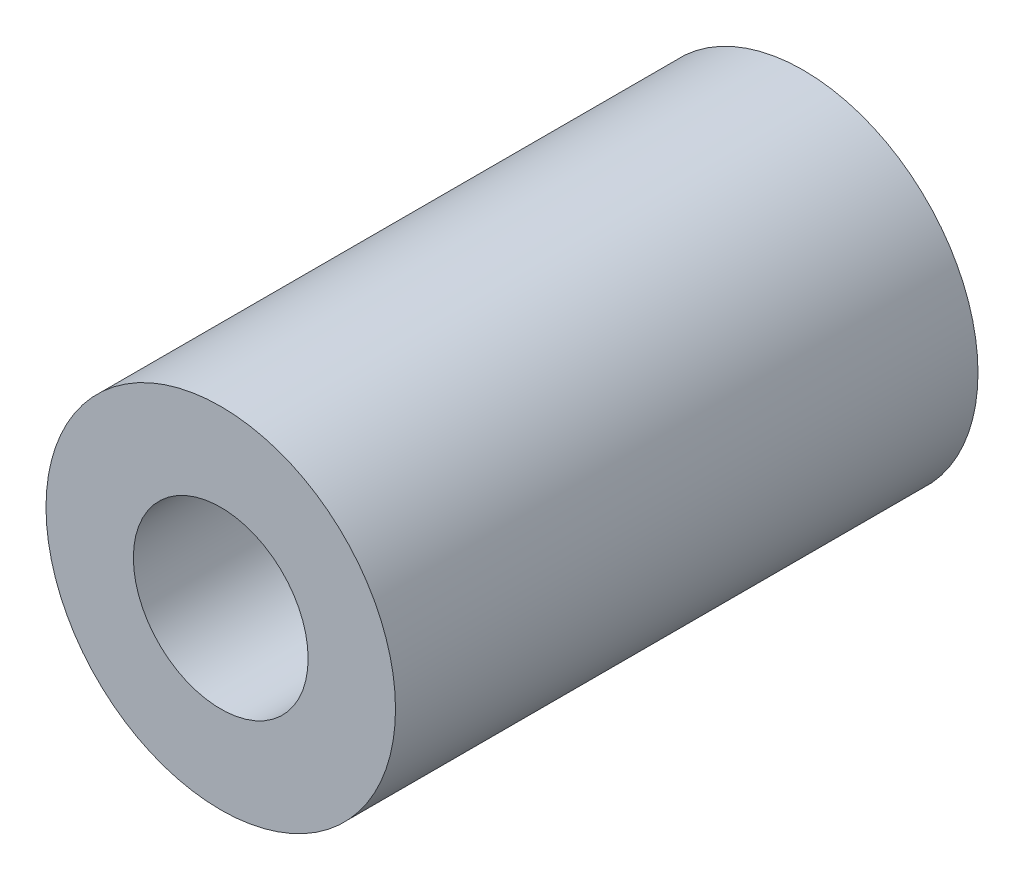
ISO-10303-21;
HEADER;
FILE_DESCRIPTION(('STEP AP214'),'2;1');
FILE_NAME('part.step','',(''),(''),'','','');
FILE_SCHEMA(('AUTOMOTIVE_DESIGN { 1 0 10303 214 1 1 1 1 }'));
ENDSEC;
DATA;
#1=APPLICATION_CONTEXT('core data for automotive mechanical design processes');
#2=APPLICATION_PROTOCOL_DEFINITION('international standard','automotive_design',2000,#1);
#3=PRODUCT_CONTEXT('',#1,'mechanical');
#4=PRODUCT('Part','Part','',(#3));
#5=PRODUCT_RELATED_PRODUCT_CATEGORY('part','',(#4));
#6=PRODUCT_DEFINITION_FORMATION('','',#4);
#7=PRODUCT_DEFINITION_CONTEXT('part definition',#1,'design');
#8=PRODUCT_DEFINITION('design','',#6,#7);
#9=PRODUCT_DEFINITION_SHAPE('','',#8);
#10=(LENGTH_UNIT() NAMED_UNIT(*) SI_UNIT(.MILLI.,.METRE.));
#11=(NAMED_UNIT(*) PLANE_ANGLE_UNIT() SI_UNIT($,.RADIAN.));
#12=(NAMED_UNIT(*) SI_UNIT($,.STERADIAN.) SOLID_ANGLE_UNIT());
#13=UNCERTAINTY_MEASURE_WITH_UNIT(LENGTH_MEASURE(1.E-05),#10,'distance_accuracy_value','');
#14=(GEOMETRIC_REPRESENTATION_CONTEXT(3) GLOBAL_UNCERTAINTY_ASSIGNED_CONTEXT((#13)) GLOBAL_UNIT_ASSIGNED_CONTEXT((#10,
#11,#12)) REPRESENTATION_CONTEXT('',''));
#15=CARTESIAN_POINT('',(0.,0.,0.));
#16=DIRECTION('',(0.,0.,1.));
#17=DIRECTION('',(1.,0.,0.));
#18=AXIS2_PLACEMENT_3D('',#15,#16,#17);
#19=CARTESIAN_POINT('',(0.,0.,10.));
#20=DIRECTION('',(0.,0.,1.));
#21=DIRECTION('',(1.,0.,0.));
#22=AXIS2_PLACEMENT_3D('',#19,#20,#21);
#23=PLANE('',#22);
#24=CARTESIAN_POINT('',(0.,0.,10.));
#25=DIRECTION('',(0.,0.,1.));
#26=DIRECTION('',(1.,0.,0.));
#27=AXIS2_PLACEMENT_3D('',#24,#25,#26);
#28=CIRCLE('',#27,3.);
#29=CARTESIAN_POINT('',(3.,0.,10.));
#30=VERTEX_POINT('',#29);
#31=EDGE_CURVE('E10',#30,#30,#28,.T.);
#32=ORIENTED_EDGE('',*,*,#31,.T.);
#33=EDGE_LOOP('',(#32));
#34=FACE_BOUND('',#33,.T.);
#35=CARTESIAN_POINT('',(0.,0.,10.));
#36=DIRECTION('',(0.,0.,1.));
#37=DIRECTION('',(1.,0.,0.));
#38=AXIS2_PLACEMENT_3D('',#35,#36,#37);
#39=CIRCLE('',#38,1.5);
#40=CARTESIAN_POINT('',(1.5,0.,10.));
#41=VERTEX_POINT('',#40);
#42=EDGE_CURVE('E43',#41,#41,#39,.T.);
#43=ORIENTED_EDGE('',*,*,#42,.F.);
#44=EDGE_LOOP('',(#43));
#45=FACE_BOUND('',#44,.T.);
#46=ADVANCED_FACE('F32',(#34,#45),#23,.T.);
#47=CARTESIAN_POINT('',(0.,0.,0.));
#48=DIRECTION('',(0.,0.,1.));
#49=DIRECTION('',(1.,0.,0.));
#50=AXIS2_PLACEMENT_3D('',#47,#48,#49);
#51=PLANE('',#50);
#52=CARTESIAN_POINT('',(0.,0.,0.));
#53=DIRECTION('',(0.,0.,1.));
#54=DIRECTION('',(1.,0.,0.));
#55=AXIS2_PLACEMENT_3D('',#52,#53,#54);
#56=CIRCLE('',#55,3.);
#57=CARTESIAN_POINT('',(3.,0.,0.));
#58=VERTEX_POINT('',#57);
#59=EDGE_CURVE('E36',#58,#58,#56,.T.);
#60=ORIENTED_EDGE('',*,*,#59,.F.);
#61=EDGE_LOOP('',(#60));
#62=FACE_BOUND('',#61,.T.);
#63=CARTESIAN_POINT('',(0.,0.,0.));
#64=DIRECTION('',(0.,0.,1.));
#65=DIRECTION('',(1.,0.,0.));
#66=AXIS2_PLACEMENT_3D('',#63,#64,#65);
#67=CIRCLE('',#66,1.5);
#68=CARTESIAN_POINT('',(1.5,0.,0.));
#69=VERTEX_POINT('',#68);
#70=EDGE_CURVE('E45',#69,#69,#67,.T.);
#71=ORIENTED_EDGE('',*,*,#70,.T.);
#72=EDGE_LOOP('',(#71));
#73=FACE_BOUND('',#72,.T.);
#74=ADVANCED_FACE('F55',(#62,#73),#51,.F.);
#75=CARTESIAN_POINT('',(0.,0.,10.));
#76=DIRECTION('',(0.,0.,-1.));
#77=DIRECTION('',(-1.,0.,0.));
#78=AXIS2_PLACEMENT_3D('',#75,#76,#77);
#79=CYLINDRICAL_SURFACE('',#78,3.);
#80=ORIENTED_EDGE('',*,*,#31,.F.);
#81=EDGE_LOOP('',(#80));
#82=FACE_BOUND('',#81,.T.);
#83=ORIENTED_EDGE('',*,*,#59,.T.);
#84=EDGE_LOOP('',(#83));
#85=FACE_BOUND('',#84,.T.);
#86=ADVANCED_FACE('F34',(#82,#85),#79,.T.);
#87=CARTESIAN_POINT('',(0.,0.,10.));
#88=DIRECTION('',(0.,0.,-1.));
#89=DIRECTION('',(-1.,0.,0.));
#90=AXIS2_PLACEMENT_3D('',#87,#88,#89);
#91=CYLINDRICAL_SURFACE('',#90,1.5);
#92=ORIENTED_EDGE('',*,*,#42,.T.);
#93=EDGE_LOOP('',(#92));
#94=FACE_BOUND('',#93,.T.);
#95=ORIENTED_EDGE('',*,*,#70,.F.);
#96=EDGE_LOOP('',(#95));
#97=FACE_BOUND('',#96,.T.);
#98=ADVANCED_FACE('F51',(#94,#97),#91,.F.);
#99=CLOSED_SHELL('',(#46,#74,#86,#98));
#100=MANIFOLD_SOLID_BREP('B2',#99);
#101=ADVANCED_BREP_SHAPE_REPRESENTATION('',(#18,#100),#14);
#102=SHAPE_DEFINITION_REPRESENTATION(#9,#101);
ENDSEC;
END-ISO-10303-21;
